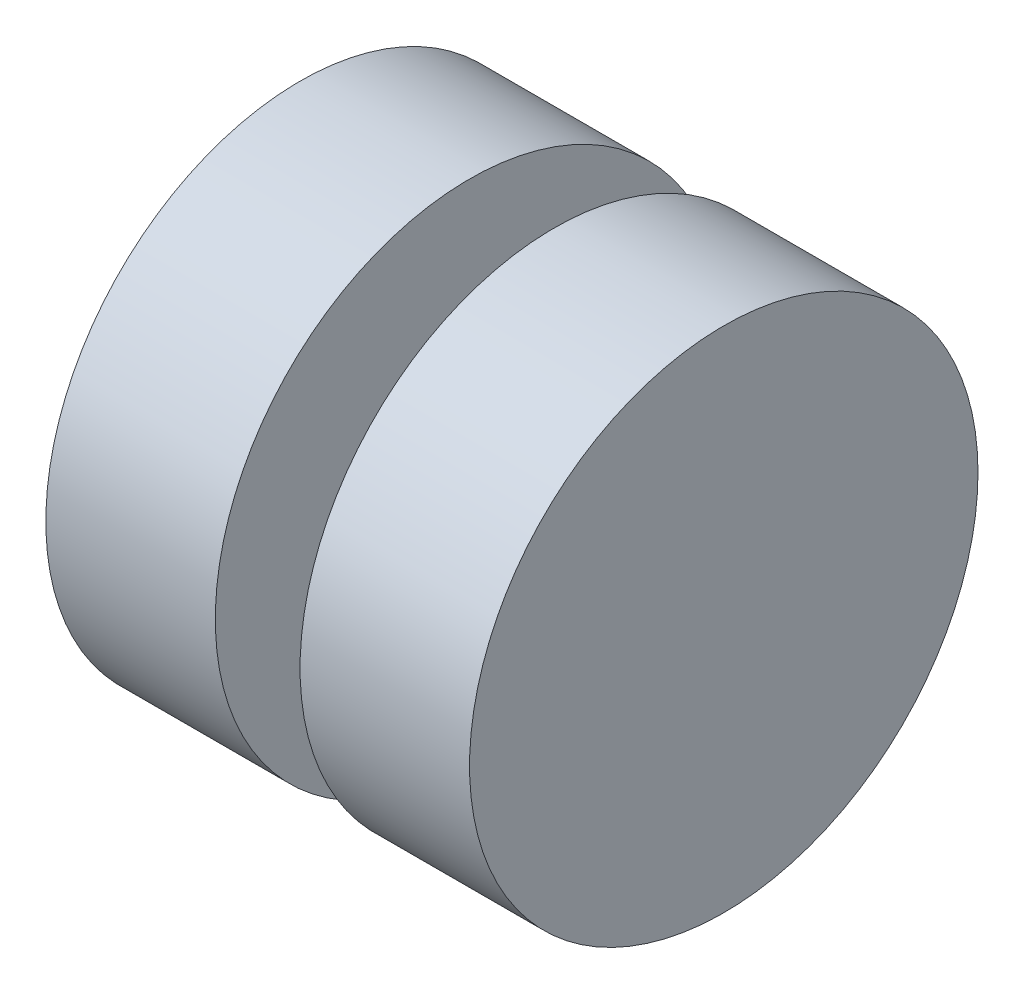
ISO-10303-21;
HEADER;
FILE_DESCRIPTION(('STEP AP214'),'2;1');
FILE_NAME('part.step','',(''),(''),'','','');
FILE_SCHEMA(('AUTOMOTIVE_DESIGN { 1 0 10303 214 1 1 1 1 }'));
ENDSEC;
DATA;
#1=APPLICATION_CONTEXT('core data for automotive mechanical design processes');
#2=APPLICATION_PROTOCOL_DEFINITION('international standard','automotive_design',2000,#1);
#3=PRODUCT_CONTEXT('',#1,'mechanical');
#4=PRODUCT('Part','Part','',(#3));
#5=PRODUCT_RELATED_PRODUCT_CATEGORY('part','',(#4));
#6=PRODUCT_DEFINITION_FORMATION('','',#4);
#7=PRODUCT_DEFINITION_CONTEXT('part definition',#1,'design');
#8=PRODUCT_DEFINITION('design','',#6,#7);
#9=PRODUCT_DEFINITION_SHAPE('','',#8);
#10=(LENGTH_UNIT() NAMED_UNIT(*) SI_UNIT(.MILLI.,.METRE.));
#11=(NAMED_UNIT(*) PLANE_ANGLE_UNIT() SI_UNIT($,.RADIAN.));
#12=(NAMED_UNIT(*) SI_UNIT($,.STERADIAN.) SOLID_ANGLE_UNIT());
#13=UNCERTAINTY_MEASURE_WITH_UNIT(LENGTH_MEASURE(1.E-05),#10,'distance_accuracy_value','');
#14=(GEOMETRIC_REPRESENTATION_CONTEXT(3) GLOBAL_UNCERTAINTY_ASSIGNED_CONTEXT((#13)) GLOBAL_UNIT_ASSIGNED_CONTEXT((#10,
#11,#12)) REPRESENTATION_CONTEXT('',''));
#15=CARTESIAN_POINT('',(0.,0.,0.));
#16=DIRECTION('',(0.,0.,1.));
#17=DIRECTION('',(1.,0.,0.));
#18=AXIS2_PLACEMENT_3D('',#15,#16,#17);
#19=CARTESIAN_POINT('',(10.,0.,0.));
#20=DIRECTION('',(-1.,0.,0.));
#21=DIRECTION('',(0.,0.,1.));
#22=AXIS2_PLACEMENT_3D('',#19,#20,#21);
#23=CYLINDRICAL_SURFACE('',#22,15.);
#24=CARTESIAN_POINT('',(10.,0.,0.));
#25=DIRECTION('',(1.,0.,0.));
#26=DIRECTION('',(0.,0.,-1.));
#27=AXIS2_PLACEMENT_3D('',#24,#25,#26);
#28=CIRCLE('',#27,15.);
#29=CARTESIAN_POINT('',(10.,0.,-15.));
#30=VERTEX_POINT('',#29);
#31=EDGE_CURVE('E10',#30,#30,#28,.T.);
#32=ORIENTED_EDGE('',*,*,#31,.F.);
#33=EDGE_LOOP('',(#32));
#34=FACE_BOUND('',#33,.T.);
#35=CARTESIAN_POINT('',(0.,0.,0.));
#36=DIRECTION('',(1.,0.,0.));
#37=DIRECTION('',(0.,0.,-1.));
#38=AXIS2_PLACEMENT_3D('',#35,#36,#37);
#39=CIRCLE('',#38,15.);
#40=CARTESIAN_POINT('',(0.,0.,-15.));
#41=VERTEX_POINT('',#40);
#42=EDGE_CURVE('E37',#41,#41,#39,.T.);
#43=ORIENTED_EDGE('',*,*,#42,.T.);
#44=EDGE_LOOP('',(#43));
#45=FACE_BOUND('',#44,.T.);
#46=ADVANCED_FACE('F34',(#34,#45),#23,.T.);
#47=CARTESIAN_POINT('',(10.,0.,0.));
#48=DIRECTION('',(1.,0.,0.));
#49=DIRECTION('',(0.,0.,-1.));
#50=AXIS2_PLACEMENT_3D('',#47,#48,#49);
#51=PLANE('',#50);
#52=CARTESIAN_POINT('',(10.,0.,0.));
#53=DIRECTION('',(1.,0.,0.));
#54=DIRECTION('',(0.,0.,-1.));
#55=AXIS2_PLACEMENT_3D('',#52,#53,#54);
#56=CIRCLE('',#55,5.);
#57=CARTESIAN_POINT('',(10.,0.,-5.));
#58=VERTEX_POINT('',#57);
#59=EDGE_CURVE('E46',#58,#58,#56,.T.);
#60=ORIENTED_EDGE('',*,*,#59,.F.);
#61=EDGE_LOOP('',(#60));
#62=FACE_BOUND('',#61,.T.);
#63=ORIENTED_EDGE('',*,*,#31,.T.);
#64=EDGE_LOOP('',(#63));
#65=FACE_BOUND('',#64,.T.);
#66=ADVANCED_FACE('F76',(#62,#65),#51,.T.);
#67=CARTESIAN_POINT('',(0.,0.,0.));
#68=DIRECTION('',(1.,0.,0.));
#69=DIRECTION('',(0.,0.,-1.));
#70=AXIS2_PLACEMENT_3D('',#67,#68,#69);
#71=PLANE('',#70);
#72=ORIENTED_EDGE('',*,*,#42,.F.);
#73=EDGE_LOOP('',(#72));
#74=FACE_BOUND('',#73,.T.);
#75=ADVANCED_FACE('F81',(#74),#71,.F.);
#76=CARTESIAN_POINT('',(15.,0.,0.));
#77=DIRECTION('',(-1.,0.,0.));
#78=DIRECTION('',(0.,0.,1.));
#79=AXIS2_PLACEMENT_3D('',#76,#77,#78);
#80=CYLINDRICAL_SURFACE('',#79,5.);
#81=CARTESIAN_POINT('',(15.,0.,0.));
#82=DIRECTION('',(1.,0.,0.));
#83=DIRECTION('',(0.,0.,-1.));
#84=AXIS2_PLACEMENT_3D('',#81,#82,#83);
#85=CIRCLE('',#84,5.);
#86=CARTESIAN_POINT('',(15.,0.,-5.));
#87=VERTEX_POINT('',#86);
#88=EDGE_CURVE('E44',#87,#87,#85,.T.);
#89=ORIENTED_EDGE('',*,*,#88,.F.);
#90=EDGE_LOOP('',(#89));
#91=FACE_BOUND('',#90,.T.);
#92=ORIENTED_EDGE('',*,*,#59,.T.);
#93=EDGE_LOOP('',(#92));
#94=FACE_BOUND('',#93,.T.);
#95=ADVANCED_FACE('F63',(#91,#94),#80,.T.);
#96=CARTESIAN_POINT('',(25.,0.,0.));
#97=DIRECTION('',(-1.,0.,0.));
#98=DIRECTION('',(0.,0.,1.));
#99=AXIS2_PLACEMENT_3D('',#96,#97,#98);
#100=CYLINDRICAL_SURFACE('',#99,15.);
#101=CARTESIAN_POINT('',(25.,0.,0.));
#102=DIRECTION('',(1.,0.,0.));
#103=DIRECTION('',(0.,0.,-1.));
#104=AXIS2_PLACEMENT_3D('',#101,#102,#103);
#105=CIRCLE('',#104,15.);
#106=CARTESIAN_POINT('',(25.,0.,-15.));
#107=VERTEX_POINT('',#106);
#108=EDGE_CURVE('E49',#107,#107,#105,.T.);
#109=ORIENTED_EDGE('',*,*,#108,.F.);
#110=EDGE_LOOP('',(#109));
#111=FACE_BOUND('',#110,.T.);
#112=CARTESIAN_POINT('',(15.,0.,0.));
#113=DIRECTION('',(1.,0.,0.));
#114=DIRECTION('',(0.,0.,-1.));
#115=AXIS2_PLACEMENT_3D('',#112,#113,#114);
#116=CIRCLE('',#115,15.);
#117=CARTESIAN_POINT('',(15.,0.,-15.));
#118=VERTEX_POINT('',#117);
#119=EDGE_CURVE('E52',#118,#118,#116,.T.);
#120=ORIENTED_EDGE('',*,*,#119,.T.);
#121=EDGE_LOOP('',(#120));
#122=FACE_BOUND('',#121,.T.);
#123=ADVANCED_FACE('F60',(#111,#122),#100,.T.);
#124=CARTESIAN_POINT('',(25.,0.,0.));
#125=DIRECTION('',(1.,0.,0.));
#126=DIRECTION('',(0.,0.,-1.));
#127=AXIS2_PLACEMENT_3D('',#124,#125,#126);
#128=PLANE('',#127);
#129=ORIENTED_EDGE('',*,*,#108,.T.);
#130=EDGE_LOOP('',(#129));
#131=FACE_BOUND('',#130,.T.);
#132=ADVANCED_FACE('F58',(#131),#128,.T.);
#133=CARTESIAN_POINT('',(15.,0.,0.));
#134=DIRECTION('',(1.,0.,0.));
#135=DIRECTION('',(0.,0.,-1.));
#136=AXIS2_PLACEMENT_3D('',#133,#134,#135);
#137=PLANE('',#136);
#138=ORIENTED_EDGE('',*,*,#88,.T.);
#139=EDGE_LOOP('',(#138));
#140=FACE_BOUND('',#139,.T.);
#141=ORIENTED_EDGE('',*,*,#119,.F.);
#142=EDGE_LOOP('',(#141));
#143=FACE_BOUND('',#142,.T.);
#144=ADVANCED_FACE('F67',(#140,#143),#137,.F.);
#145=CLOSED_SHELL('',(#46,#66,#75,#95,#123,#132,#144));
#146=MANIFOLD_SOLID_BREP('B2',#145);
#147=ADVANCED_BREP_SHAPE_REPRESENTATION('',(#18,#146),#14);
#148=SHAPE_DEFINITION_REPRESENTATION(#9,#147);
ENDSEC;
END-ISO-10303-21;
